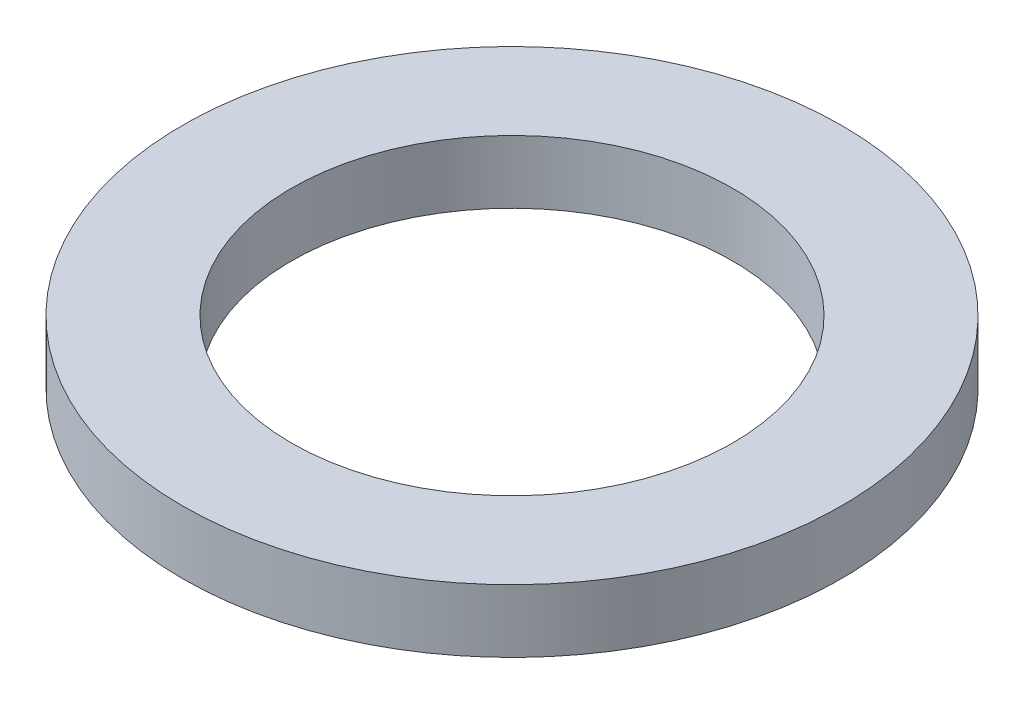
ISO-10303-21;
HEADER;
FILE_DESCRIPTION(('STEP AP214'),'2;1');
FILE_NAME('part.step','',(''),(''),'','','');
FILE_SCHEMA(('AUTOMOTIVE_DESIGN { 1 0 10303 214 1 1 1 1 }'));
ENDSEC;
DATA;
#1=APPLICATION_CONTEXT('core data for automotive mechanical design processes');
#2=APPLICATION_PROTOCOL_DEFINITION('international standard','automotive_design',2000,#1);
#3=PRODUCT_CONTEXT('',#1,'mechanical');
#4=PRODUCT('Part','Part','',(#3));
#5=PRODUCT_RELATED_PRODUCT_CATEGORY('part','',(#4));
#6=PRODUCT_DEFINITION_FORMATION('','',#4);
#7=PRODUCT_DEFINITION_CONTEXT('part definition',#1,'design');
#8=PRODUCT_DEFINITION('design','',#6,#7);
#9=PRODUCT_DEFINITION_SHAPE('','',#8);
#10=(LENGTH_UNIT() NAMED_UNIT(*) SI_UNIT(.MILLI.,.METRE.));
#11=(NAMED_UNIT(*) PLANE_ANGLE_UNIT() SI_UNIT($,.RADIAN.));
#12=(NAMED_UNIT(*) SI_UNIT($,.STERADIAN.) SOLID_ANGLE_UNIT());
#13=UNCERTAINTY_MEASURE_WITH_UNIT(LENGTH_MEASURE(1.E-05),#10,'distance_accuracy_value','');
#14=(GEOMETRIC_REPRESENTATION_CONTEXT(3) GLOBAL_UNCERTAINTY_ASSIGNED_CONTEXT((#13)) GLOBAL_UNIT_ASSIGNED_CONTEXT((#10,
#11,#12)) REPRESENTATION_CONTEXT('',''));
#15=CARTESIAN_POINT('',(0.,0.,0.));
#16=DIRECTION('',(0.,0.,1.));
#17=DIRECTION('',(1.,0.,0.));
#18=AXIS2_PLACEMENT_3D('',#15,#16,#17);
#19=CARTESIAN_POINT('',(0.,2.2,0.));
#20=DIRECTION('',(0.,1.,0.));
#21=DIRECTION('',(0.,0.,1.));
#22=AXIS2_PLACEMENT_3D('',#19,#20,#21);
#23=PLANE('',#22);
#24=CARTESIAN_POINT('',(0.,2.2,0.));
#25=DIRECTION('',(0.,1.,0.));
#26=DIRECTION('',(0.,0.,1.));
#27=AXIS2_PLACEMENT_3D('',#24,#25,#26);
#28=CIRCLE('',#27,11.5);
#29=CARTESIAN_POINT('',(0.,2.2,11.5));
#30=VERTEX_POINT('',#29);
#31=EDGE_CURVE('E10',#30,#30,#28,.T.);
#32=ORIENTED_EDGE('',*,*,#31,.T.);
#33=EDGE_LOOP('',(#32));
#34=FACE_BOUND('',#33,.T.);
#35=CARTESIAN_POINT('',(0.,2.2,0.));
#36=DIRECTION('',(0.,1.,0.));
#37=DIRECTION('',(0.,0.,1.));
#38=AXIS2_PLACEMENT_3D('',#35,#36,#37);
#39=CIRCLE('',#38,7.7);
#40=CARTESIAN_POINT('',(0.,2.2,7.7));
#41=VERTEX_POINT('',#40);
#42=EDGE_CURVE('E50',#41,#41,#39,.T.);
#43=ORIENTED_EDGE('',*,*,#42,.F.);
#44=EDGE_LOOP('',(#43));
#45=FACE_BOUND('',#44,.T.);
#46=ADVANCED_FACE('F39',(#34,#45),#23,.T.);
#47=CARTESIAN_POINT('',(0.,0.,0.));
#48=DIRECTION('',(0.,1.,0.));
#49=DIRECTION('',(0.,0.,1.));
#50=AXIS2_PLACEMENT_3D('',#47,#48,#49);
#51=PLANE('',#50);
#52=CARTESIAN_POINT('',(0.,0.,0.));
#53=DIRECTION('',(0.,1.,0.));
#54=DIRECTION('',(0.,0.,1.));
#55=AXIS2_PLACEMENT_3D('',#52,#53,#54);
#56=CIRCLE('',#55,11.5);
#57=CARTESIAN_POINT('',(0.,0.,11.5));
#58=VERTEX_POINT('',#57);
#59=EDGE_CURVE('E43',#58,#58,#56,.T.);
#60=ORIENTED_EDGE('',*,*,#59,.F.);
#61=EDGE_LOOP('',(#60));
#62=FACE_BOUND('',#61,.T.);
#63=CARTESIAN_POINT('',(0.,0.,0.));
#64=DIRECTION('',(0.,1.,0.));
#65=DIRECTION('',(0.,0.,1.));
#66=AXIS2_PLACEMENT_3D('',#63,#64,#65);
#67=CIRCLE('',#66,7.7);
#68=CARTESIAN_POINT('',(0.,0.,7.7));
#69=VERTEX_POINT('',#68);
#70=EDGE_CURVE('E52',#69,#69,#67,.T.);
#71=ORIENTED_EDGE('',*,*,#70,.T.);
#72=EDGE_LOOP('',(#71));
#73=FACE_BOUND('',#72,.T.);
#74=ADVANCED_FACE('F62',(#62,#73),#51,.F.);
#75=CARTESIAN_POINT('',(0.,2.2,0.));
#76=DIRECTION('',(0.,-1.,0.));
#77=DIRECTION('',(0.,0.,-1.));
#78=AXIS2_PLACEMENT_3D('',#75,#76,#77);
#79=CYLINDRICAL_SURFACE('',#78,11.5);
#80=ORIENTED_EDGE('',*,*,#31,.F.);
#81=EDGE_LOOP('',(#80));
#82=FACE_BOUND('',#81,.T.);
#83=ORIENTED_EDGE('',*,*,#59,.T.);
#84=EDGE_LOOP('',(#83));
#85=FACE_BOUND('',#84,.T.);
#86=ADVANCED_FACE('F41',(#82,#85),#79,.T.);
#87=CARTESIAN_POINT('',(0.,2.2,0.));
#88=DIRECTION('',(0.,-1.,0.));
#89=DIRECTION('',(0.,0.,-1.));
#90=AXIS2_PLACEMENT_3D('',#87,#88,#89);
#91=CYLINDRICAL_SURFACE('',#90,7.7);
#92=ORIENTED_EDGE('',*,*,#42,.T.);
#93=EDGE_LOOP('',(#92));
#94=FACE_BOUND('',#93,.T.);
#95=ORIENTED_EDGE('',*,*,#70,.F.);
#96=EDGE_LOOP('',(#95));
#97=FACE_BOUND('',#96,.T.);
#98=ADVANCED_FACE('F58',(#94,#97),#91,.F.);
#99=CLOSED_SHELL('',(#46,#74,#86,#98));
#100=MANIFOLD_SOLID_BREP('B2',#99);
#101=ADVANCED_BREP_SHAPE_REPRESENTATION('',(#18,#100),#14);
#102=SHAPE_DEFINITION_REPRESENTATION(#9,#101);
ENDSEC;
END-ISO-10303-21;
